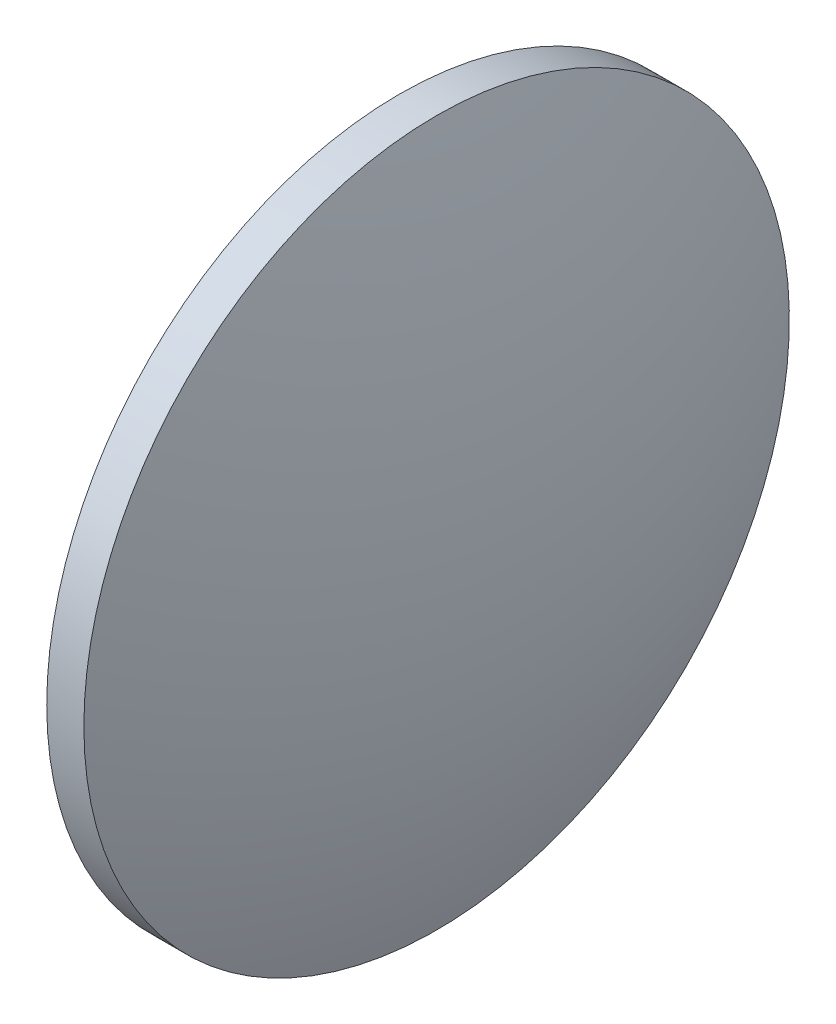
ISO-10303-21;
HEADER;
FILE_DESCRIPTION(('STEP AP214'),'2;1');
FILE_NAME('part.step','',(''),(''),'','','');
FILE_SCHEMA(('AUTOMOTIVE_DESIGN { 1 0 10303 214 1 1 1 1 }'));
ENDSEC;
DATA;
#1=APPLICATION_CONTEXT('core data for automotive mechanical design processes');
#2=APPLICATION_PROTOCOL_DEFINITION('international standard','automotive_design',2000,#1);
#3=PRODUCT_CONTEXT('',#1,'mechanical');
#4=PRODUCT('Part','Part','',(#3));
#5=PRODUCT_RELATED_PRODUCT_CATEGORY('part','',(#4));
#6=PRODUCT_DEFINITION_FORMATION('','',#4);
#7=PRODUCT_DEFINITION_CONTEXT('part definition',#1,'design');
#8=PRODUCT_DEFINITION('design','',#6,#7);
#9=PRODUCT_DEFINITION_SHAPE('','',#8);
#10=(LENGTH_UNIT() NAMED_UNIT(*) SI_UNIT(.MILLI.,.METRE.));
#11=(NAMED_UNIT(*) PLANE_ANGLE_UNIT() SI_UNIT($,.RADIAN.));
#12=(NAMED_UNIT(*) SI_UNIT($,.STERADIAN.) SOLID_ANGLE_UNIT());
#13=UNCERTAINTY_MEASURE_WITH_UNIT(LENGTH_MEASURE(1.E-05),#10,'distance_accuracy_value','');
#14=(GEOMETRIC_REPRESENTATION_CONTEXT(3) GLOBAL_UNCERTAINTY_ASSIGNED_CONTEXT((#13)) GLOBAL_UNIT_ASSIGNED_CONTEXT((#10,
#11,#12)) REPRESENTATION_CONTEXT('',''));
#15=CARTESIAN_POINT('',(0.,0.,0.));
#16=DIRECTION('',(0.,0.,1.));
#17=DIRECTION('',(1.,0.,0.));
#18=AXIS2_PLACEMENT_3D('',#15,#16,#17);
#19=CARTESIAN_POINT('',(50.,0.,0.));
#20=DIRECTION('',(-1.,0.,0.));
#21=DIRECTION('',(0.,1.,0.));
#22=AXIS2_PLACEMENT_3D('',#19,#20,#21);
#23=SPHERICAL_SURFACE('',#22,53.4883164812653);
#24=CARTESIAN_POINT('',(0.,0.,0.));
#25=DIRECTION('',(-1.,0.,0.));
#26=DIRECTION('',(0.,0.,1.));
#27=AXIS2_PLACEMENT_3D('',#24,#25,#26);
#28=CIRCLE('',#27,19.);
#29=CARTESIAN_POINT('',(0.,0.,19.));
#30=VERTEX_POINT('',#29);
#31=EDGE_CURVE('E39',#30,#30,#28,.T.);
#32=ORIENTED_EDGE('',*,*,#31,.T.);
#33=EDGE_LOOP('',(#32));
#34=FACE_BOUND('',#33,.T.);
#35=ADVANCED_FACE('F33',(#34),#23,.T.);
#36=CARTESIAN_POINT('',(-50.,0.,0.));
#37=DIRECTION('',(-1.,0.,0.));
#38=DIRECTION('',(0.,1.,0.));
#39=AXIS2_PLACEMENT_3D('',#36,#37,#38);
#40=SPHERICAL_SURFACE('',#39,55.3624421426656);
#41=CARTESIAN_POINT('',(2.,0.,0.));
#42=DIRECTION('',(-1.,0.,0.));
#43=DIRECTION('',(0.,0.,1.));
#44=AXIS2_PLACEMENT_3D('',#41,#42,#43);
#45=CIRCLE('',#44,19.);
#46=CARTESIAN_POINT('',(2.,0.,19.));
#47=VERTEX_POINT('',#46);
#48=EDGE_CURVE('E10',#47,#47,#45,.T.);
#49=ORIENTED_EDGE('',*,*,#48,.F.);
#50=EDGE_LOOP('',(#49));
#51=FACE_BOUND('',#50,.T.);
#52=ADVANCED_FACE('F48',(#51),#40,.T.);
#53=CARTESIAN_POINT('',(-3.48831648126532,0.,0.));
#54=DIRECTION('',(-1.,0.,0.));
#55=DIRECTION('',(0.,0.,1.));
#56=AXIS2_PLACEMENT_3D('',#53,#54,#55);
#57=CYLINDRICAL_SURFACE('',#56,19.);
#58=ORIENTED_EDGE('',*,*,#31,.F.);
#59=EDGE_LOOP('',(#58));
#60=FACE_BOUND('',#59,.T.);
#61=ORIENTED_EDGE('',*,*,#48,.T.);
#62=EDGE_LOOP('',(#61));
#63=FACE_BOUND('',#62,.T.);
#64=ADVANCED_FACE('F46',(#60,#63),#57,.T.);
#65=CLOSED_SHELL('',(#35,#52,#64));
#66=MANIFOLD_SOLID_BREP('B2',#65);
#67=ADVANCED_BREP_SHAPE_REPRESENTATION('',(#18,#66),#14);
#68=SHAPE_DEFINITION_REPRESENTATION(#9,#67);
ENDSEC;
END-ISO-10303-21;
